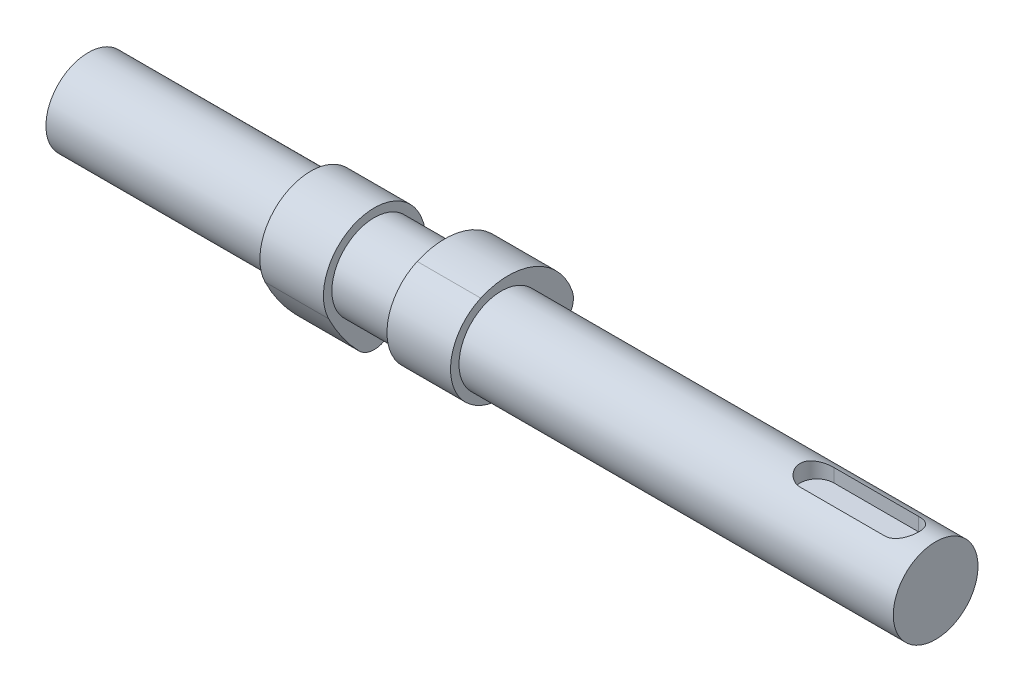
ISO-10303-21;
HEADER;
FILE_DESCRIPTION(('STEP AP214'),'2;1');
FILE_NAME('part.step','',(''),(''),'','','');
FILE_SCHEMA(('AUTOMOTIVE_DESIGN { 1 0 10303 214 1 1 1 1 }'));
ENDSEC;
DATA;
#1=APPLICATION_CONTEXT('core data for automotive mechanical design processes');
#2=APPLICATION_PROTOCOL_DEFINITION('international standard','automotive_design',2000,#1);
#3=PRODUCT_CONTEXT('',#1,'mechanical');
#4=PRODUCT('Part','Part','',(#3));
#5=PRODUCT_RELATED_PRODUCT_CATEGORY('part','',(#4));
#6=PRODUCT_DEFINITION_FORMATION('','',#4);
#7=PRODUCT_DEFINITION_CONTEXT('part definition',#1,'design');
#8=PRODUCT_DEFINITION('design','',#6,#7);
#9=PRODUCT_DEFINITION_SHAPE('','',#8);
#10=(LENGTH_UNIT() NAMED_UNIT(*) SI_UNIT(.MILLI.,.METRE.));
#11=(NAMED_UNIT(*) PLANE_ANGLE_UNIT() SI_UNIT($,.RADIAN.));
#12=(NAMED_UNIT(*) SI_UNIT($,.STERADIAN.) SOLID_ANGLE_UNIT());
#13=UNCERTAINTY_MEASURE_WITH_UNIT(LENGTH_MEASURE(1.E-05),#10,'distance_accuracy_value','');
#14=(GEOMETRIC_REPRESENTATION_CONTEXT(3) GLOBAL_UNCERTAINTY_ASSIGNED_CONTEXT((#13)) GLOBAL_UNIT_ASSIGNED_CONTEXT((#10,
#11,#12)) REPRESENTATION_CONTEXT('',''));
#15=CARTESIAN_POINT('',(0.,0.,0.));
#16=DIRECTION('',(0.,0.,1.));
#17=DIRECTION('',(1.,0.,0.));
#18=AXIS2_PLACEMENT_3D('',#15,#16,#17);
#19=CARTESIAN_POINT('',(125.,0.,0.));
#20=DIRECTION('',(-1.,0.,0.));
#21=DIRECTION('',(0.,0.,1.));
#22=AXIS2_PLACEMENT_3D('',#19,#20,#21);
#23=CYLINDRICAL_SURFACE('',#22,10.);
#24=CARTESIAN_POINT('',(7.50000000000001,0.,0.));
#25=DIRECTION('',(-1.,0.,0.));
#26=DIRECTION('',(0.,0.,1.));
#27=AXIS2_PLACEMENT_3D('',#24,#25,#26);
#28=CIRCLE('',#27,10.);
#29=CARTESIAN_POINT('',(7.50000000000001,0.,10.));
#30=VERTEX_POINT('',#29);
#31=EDGE_CURVE('E164',#30,#30,#28,.T.);
#32=ORIENTED_EDGE('',*,*,#31,.T.);
#33=EDGE_LOOP('',(#32));
#34=FACE_BOUND('',#33,.T.);
#35=CARTESIAN_POINT('',(-7.50000000000001,0.,0.));
#36=DIRECTION('',(1.,0.,0.));
#37=DIRECTION('',(0.,0.,-1.));
#38=AXIS2_PLACEMENT_3D('',#35,#36,#37);
#39=CIRCLE('',#38,10.);
#40=CARTESIAN_POINT('',(-7.50000000000001,0.,-10.));
#41=VERTEX_POINT('',#40);
#42=EDGE_CURVE('E220',#41,#41,#39,.T.);
#43=ORIENTED_EDGE('',*,*,#42,.T.);
#44=EDGE_LOOP('',(#43));
#45=FACE_BOUND('',#44,.T.);
#46=ADVANCED_FACE('F45',(#34,#45),#23,.T.);
#47=CARTESIAN_POINT('',(-22.5,-1.62236318948023,3.65621904177246));
#48=DIRECTION('',(1.,0.,0.));
#49=DIRECTION('',(0.,1.,0.));
#50=AXIS2_PLACEMENT_3D('',#47,#48,#49);
#51=CYLINDRICAL_SURFACE('',#50,16.);
#52=CARTESIAN_POINT('',(-7.5,-1.62236318948023,3.65621904177246));
#53=DIRECTION('',(1.,0.,0.));
#54=DIRECTION('',(0.,1.,0.));
#55=AXIS2_PLACEMENT_3D('',#52,#53,#54);
#56=CIRCLE('',#55,16.);
#57=CARTESIAN_POINT('',(-7.5,-16.7126720366766,-1.66191774626015));
#58=VERTEX_POINT('',#57);
#59=CARTESIAN_POINT('',(-7.5,4.86708956844069,-10.9686571253174));
#60=VERTEX_POINT('',#59);
#61=EDGE_CURVE('E170',#58,#60,#56,.T.);
#62=ORIENTED_EDGE('',*,*,#61,.F.);
#63=DIRECTION('',(1.,0.,0.));
#64=VECTOR('',#63,1.);
#65=CARTESIAN_POINT('',(-22.5,-16.7126720366766,-1.66191774626015));
#66=LINE('',#65,#64);
#67=CARTESIAN_POINT('',(-22.5,-16.7126720366766,-1.66191774626015));
#68=VERTEX_POINT('',#67);
#69=EDGE_CURVE('E191',#68,#58,#66,.T.);
#70=ORIENTED_EDGE('',*,*,#69,.F.);
#71=CARTESIAN_POINT('',(-22.5,-1.62236318948023,3.65621904177246));
#72=DIRECTION('',(1.,0.,0.));
#73=DIRECTION('',(0.,1.,0.));
#74=AXIS2_PLACEMENT_3D('',#71,#72,#73);
#75=CIRCLE('',#74,16.);
#76=CARTESIAN_POINT('',(-22.5,4.86708956844069,-10.9686571253174));
#77=VERTEX_POINT('',#76);
#78=EDGE_CURVE('E175',#68,#77,#75,.T.);
#79=ORIENTED_EDGE('',*,*,#78,.T.);
#80=DIRECTION('',(1.,0.,0.));
#81=VECTOR('',#80,1.);
#82=CARTESIAN_POINT('',(-22.5,4.86708956844069,-10.9686571253174));
#83=LINE('',#82,#81);
#84=EDGE_CURVE('E216',#77,#60,#83,.T.);
#85=ORIENTED_EDGE('',*,*,#84,.T.);
#86=EDGE_LOOP('',(#62,#70,#79,#85));
#87=FACE_BOUND('',#86,.T.);
#88=ADVANCED_FACE('F303',(#87),#51,.T.);
#89=CARTESIAN_POINT('',(-22.5,0.,0.));
#90=DIRECTION('',(1.,0.,0.));
#91=DIRECTION('',(0.,1.,0.));
#92=AXIS2_PLACEMENT_3D('',#89,#90,#91);
#93=CYLINDRICAL_SURFACE('',#92,12.);
#94=CARTESIAN_POINT('',(-7.5,0.,0.));
#95=DIRECTION('',(1.,0.,0.));
#96=DIRECTION('',(0.,-1.,0.));
#97=AXIS2_PLACEMENT_3D('',#94,#95,#96);
#98=CIRCLE('',#97,12.);
#99=CARTESIAN_POINT('',(-7.5,-5.30622661682884,10.7630831591537));
#100=VERTEX_POINT('',#99);
#101=EDGE_CURVE('E195',#60,#100,#98,.T.);
#102=ORIENTED_EDGE('',*,*,#101,.F.);
#103=ORIENTED_EDGE('',*,*,#84,.F.);
#104=CARTESIAN_POINT('',(-22.5,0.,0.));
#105=DIRECTION('',(1.,0.,0.));
#106=DIRECTION('',(0.,-1.,0.));
#107=AXIS2_PLACEMENT_3D('',#104,#105,#106);
#108=CIRCLE('',#107,12.);
#109=CARTESIAN_POINT('',(-22.5,-5.30622661682884,10.7630831591537));
#110=VERTEX_POINT('',#109);
#111=EDGE_CURVE('E179',#77,#110,#108,.T.);
#112=ORIENTED_EDGE('',*,*,#111,.T.);
#113=DIRECTION('',(1.,0.,0.));
#114=VECTOR('',#113,1.);
#115=CARTESIAN_POINT('',(-22.5,-5.30622661682884,10.7630831591537));
#116=LINE('',#115,#114);
#117=EDGE_CURVE('E212',#110,#100,#116,.T.);
#118=ORIENTED_EDGE('',*,*,#117,.T.);
#119=EDGE_LOOP('',(#102,#103,#112,#118));
#120=FACE_BOUND('',#119,.T.);
#121=ADVANCED_FACE('F309',(#120),#93,.T.);
#122=CARTESIAN_POINT('',(-22.5,12.3811954392673,-25.1138607046919));
#123=DIRECTION('',(1.,0.,0.));
#124=DIRECTION('',(0.,1.,0.));
#125=AXIS2_PLACEMENT_3D('',#122,#123,#124);
#126=CYLINDRICAL_SURFACE('',#125,40.);
#127=CARTESIAN_POINT('',(-7.5,12.3811954392673,-25.1138607046919));
#128=DIRECTION('',(1.,0.,0.));
#129=DIRECTION('',(0.,-1.,0.));
#130=AXIS2_PLACEMENT_3D('',#127,#128,#129);
#131=CIRCLE('',#130,40.);
#132=CARTESIAN_POINT('',(-7.5,-15.4795428020985,3.5876943863846));
#133=VERTEX_POINT('',#132);
#134=EDGE_CURVE('E199',#100,#133,#131,.T.);
#135=ORIENTED_EDGE('',*,*,#134,.F.);
#136=ORIENTED_EDGE('',*,*,#117,.F.);
#137=CARTESIAN_POINT('',(-22.5,12.3811954392673,-25.1138607046919));
#138=DIRECTION('',(1.,0.,0.));
#139=DIRECTION('',(0.,-1.,0.));
#140=AXIS2_PLACEMENT_3D('',#137,#138,#139);
#141=CIRCLE('',#140,40.);
#142=CARTESIAN_POINT('',(-22.5,-15.4795428020985,3.5876943863846));
#143=VERTEX_POINT('',#142);
#144=EDGE_CURVE('E184',#110,#143,#141,.T.);
#145=ORIENTED_EDGE('',*,*,#144,.T.);
#146=DIRECTION('',(1.,0.,0.));
#147=VECTOR('',#146,1.);
#148=CARTESIAN_POINT('',(-22.5,-15.4795428020985,3.5876943863846));
#149=LINE('',#148,#147);
#150=EDGE_CURVE('E208',#143,#133,#149,.T.);
#151=ORIENTED_EDGE('',*,*,#150,.T.);
#152=EDGE_LOOP('',(#135,#136,#145,#151));
#153=FACE_BOUND('',#152,.T.);
#154=ADVANCED_FACE('F429',(#153),#126,.T.);
#155=CARTESIAN_POINT('',(-22.5,-11.9969505219278,0.));
#156=DIRECTION('',(1.,0.,0.));
#157=DIRECTION('',(0.,1.,0.));
#158=AXIS2_PLACEMENT_3D('',#155,#156,#157);
#159=CYLINDRICAL_SURFACE('',#158,5.);
#160=CARTESIAN_POINT('',(-7.5,-11.9969505219278,0.));
#161=DIRECTION('',(1.,0.,0.));
#162=DIRECTION('',(0.,-1.,0.));
#163=AXIS2_PLACEMENT_3D('',#160,#161,#162);
#164=CIRCLE('',#163,5.);
#165=EDGE_CURVE('E180',#133,#58,#164,.T.);
#166=ORIENTED_EDGE('',*,*,#165,.F.);
#167=ORIENTED_EDGE('',*,*,#150,.F.);
#168=CARTESIAN_POINT('',(-22.5,-11.9969505219278,0.));
#169=DIRECTION('',(1.,0.,0.));
#170=DIRECTION('',(0.,-1.,0.));
#171=AXIS2_PLACEMENT_3D('',#168,#169,#170);
#172=CIRCLE('',#171,5.);
#173=EDGE_CURVE('E188',#143,#68,#172,.T.);
#174=ORIENTED_EDGE('',*,*,#173,.T.);
#175=ORIENTED_EDGE('',*,*,#69,.T.);
#176=EDGE_LOOP('',(#166,#167,#174,#175));
#177=FACE_BOUND('',#176,.T.);
#178=ADVANCED_FACE('F421',(#177),#159,.T.);
#179=CARTESIAN_POINT('',(-22.5,-6.80965685570399,1.82810952088625));
#180=DIRECTION('',(1.,0.,0.));
#181=DIRECTION('',(0.,1.,0.));
#182=AXIS2_PLACEMENT_3D('',#179,#180,#181);
#183=PLANE('',#182);
#184=CARTESIAN_POINT('',(-22.5,0.,0.));
#185=DIRECTION('',(1.,0.,0.));
#186=DIRECTION('',(0.,0.,-1.));
#187=AXIS2_PLACEMENT_3D('',#184,#185,#186);
#188=CIRCLE('',#187,10.);
#189=CARTESIAN_POINT('',(-22.5,0.,-10.));
#190=VERTEX_POINT('',#189);
#191=EDGE_CURVE('E54',#190,#190,#188,.T.);
#192=ORIENTED_EDGE('',*,*,#191,.T.);
#193=EDGE_LOOP('',(#192));
#194=FACE_BOUND('',#193,.T.);
#195=ORIENTED_EDGE('',*,*,#78,.F.);
#196=ORIENTED_EDGE('',*,*,#173,.F.);
#197=ORIENTED_EDGE('',*,*,#144,.F.);
#198=ORIENTED_EDGE('',*,*,#111,.F.);
#199=EDGE_LOOP('',(#195,#196,#197,#198));
#200=FACE_BOUND('',#199,.T.);
#201=ADVANCED_FACE('F412',(#194,#200),#183,.F.);
#202=CARTESIAN_POINT('',(-7.5,-6.80965685570399,1.82810952088625));
#203=DIRECTION('',(1.,0.,0.));
#204=DIRECTION('',(0.,1.,0.));
#205=AXIS2_PLACEMENT_3D('',#202,#203,#204);
#206=PLANE('',#205);
#207=ORIENTED_EDGE('',*,*,#42,.F.);
#208=EDGE_LOOP('',(#207));
#209=FACE_BOUND('',#208,.T.);
#210=ORIENTED_EDGE('',*,*,#61,.T.);
#211=ORIENTED_EDGE('',*,*,#101,.T.);
#212=ORIENTED_EDGE('',*,*,#134,.T.);
#213=ORIENTED_EDGE('',*,*,#165,.T.);
#214=EDGE_LOOP('',(#210,#211,#212,#213));
#215=FACE_BOUND('',#214,.T.);
#216=ADVANCED_FACE('F292',(#209,#215),#206,.T.);
#217=CARTESIAN_POINT('',(-75.,0.,0.));
#218=DIRECTION('',(1.,0.,0.));
#219=DIRECTION('',(0.,0.,-1.));
#220=AXIS2_PLACEMENT_3D('',#217,#218,#219);
#221=PLANE('',#220);
#222=CARTESIAN_POINT('',(-75.,0.,0.));
#223=DIRECTION('',(1.,0.,0.));
#224=DIRECTION('',(0.,0.,-1.));
#225=AXIS2_PLACEMENT_3D('',#222,#223,#224);
#226=CIRCLE('',#225,10.);
#227=CARTESIAN_POINT('',(-75.,0.,-10.));
#228=VERTEX_POINT('',#227);
#229=EDGE_CURVE('E241',#228,#228,#226,.T.);
#230=ORIENTED_EDGE('',*,*,#229,.F.);
#231=EDGE_LOOP('',(#230));
#232=FACE_BOUND('',#231,.T.);
#233=ADVANCED_FACE('F289',(#232),#221,.F.);
#234=ORIENTED_EDGE('',*,*,#229,.T.);
#235=EDGE_LOOP('',(#234));
#236=FACE_BOUND('',#235,.T.);
#237=ORIENTED_EDGE('',*,*,#191,.F.);
#238=EDGE_LOOP('',(#237));
#239=FACE_BOUND('',#238,.T.);
#240=ADVANCED_FACE('F291',(#236,#239),#23,.T.);
#241=CARTESIAN_POINT('',(22.5,-3.65621904177246,-1.62236318948024));
#242=DIRECTION('',(-1.,0.,0.));
#243=DIRECTION('',(0.,0.,1.));
#244=AXIS2_PLACEMENT_3D('',#241,#242,#243);
#245=CYLINDRICAL_SURFACE('',#244,16.);
#246=CARTESIAN_POINT('',(7.5,-3.65621904177246,-1.62236318948024));
#247=DIRECTION('',(1.,0.,0.));
#248=DIRECTION('',(0.,0.,1.));
#249=AXIS2_PLACEMENT_3D('',#246,#247,#248);
#250=CIRCLE('',#249,16.);
#251=CARTESIAN_POINT('',(7.5,1.6619177462602,-16.7126720366766));
#252=VERTEX_POINT('',#251);
#253=CARTESIAN_POINT('',(7.5,10.9686571253174,4.86708956844073));
#254=VERTEX_POINT('',#253);
#255=EDGE_CURVE('E162',#252,#254,#250,.T.);
#256=ORIENTED_EDGE('',*,*,#255,.T.);
#257=DIRECTION('',(-1.,0.,0.));
#258=VECTOR('',#257,1.);
#259=CARTESIAN_POINT('',(22.5,10.9686571253174,4.86708956844073));
#260=LINE('',#259,#258);
#261=CARTESIAN_POINT('',(22.5,10.9686571253174,4.86708956844073));
#262=VERTEX_POINT('',#261);
#263=EDGE_CURVE('E140',#262,#254,#260,.T.);
#264=ORIENTED_EDGE('',*,*,#263,.F.);
#265=CARTESIAN_POINT('',(22.5,-3.65621904177246,-1.62236318948024));
#266=DIRECTION('',(1.,0.,0.));
#267=DIRECTION('',(0.,0.,1.));
#268=AXIS2_PLACEMENT_3D('',#265,#266,#267);
#269=CIRCLE('',#268,16.);
#270=CARTESIAN_POINT('',(22.5,1.6619177462602,-16.7126720366766));
#271=VERTEX_POINT('',#270);
#272=EDGE_CURVE('E148',#271,#262,#269,.T.);
#273=ORIENTED_EDGE('',*,*,#272,.F.);
#274=DIRECTION('',(-1.,0.,0.));
#275=VECTOR('',#274,1.);
#276=CARTESIAN_POINT('',(22.5,1.6619177462602,-16.7126720366766));
#277=LINE('',#276,#275);
#278=EDGE_CURVE('E583',#271,#252,#277,.T.);
#279=ORIENTED_EDGE('',*,*,#278,.T.);
#280=EDGE_LOOP('',(#256,#264,#273,#279));
#281=FACE_BOUND('',#280,.T.);
#282=ADVANCED_FACE('F160',(#281),#245,.T.);
#283=CARTESIAN_POINT('',(22.5,0.,0.));
#284=DIRECTION('',(-1.,0.,0.));
#285=DIRECTION('',(0.,0.,1.));
#286=AXIS2_PLACEMENT_3D('',#283,#284,#285);
#287=CYLINDRICAL_SURFACE('',#286,12.);
#288=CARTESIAN_POINT('',(7.5,0.,0.));
#289=DIRECTION('',(1.,0.,0.));
#290=DIRECTION('',(0.,0.,-1.));
#291=AXIS2_PLACEMENT_3D('',#288,#289,#290);
#292=CIRCLE('',#291,12.);
#293=CARTESIAN_POINT('',(7.5,-10.7630831591536,-5.30622661682888));
#294=VERTEX_POINT('',#293);
#295=EDGE_CURVE('E580',#254,#294,#292,.T.);
#296=ORIENTED_EDGE('',*,*,#295,.T.);
#297=DIRECTION('',(-1.,0.,0.));
#298=VECTOR('',#297,1.);
#299=CARTESIAN_POINT('',(22.5,-10.7630831591536,-5.30622661682888));
#300=LINE('',#299,#298);
#301=CARTESIAN_POINT('',(22.5,-10.7630831591536,-5.30622661682888));
#302=VERTEX_POINT('',#301);
#303=EDGE_CURVE('E143',#302,#294,#300,.T.);
#304=ORIENTED_EDGE('',*,*,#303,.F.);
#305=CARTESIAN_POINT('',(22.5,0.,0.));
#306=DIRECTION('',(1.,0.,0.));
#307=DIRECTION('',(0.,0.,-1.));
#308=AXIS2_PLACEMENT_3D('',#305,#306,#307);
#309=CIRCLE('',#308,12.);
#310=EDGE_CURVE('E136',#262,#302,#309,.T.);
#311=ORIENTED_EDGE('',*,*,#310,.F.);
#312=ORIENTED_EDGE('',*,*,#263,.T.);
#313=EDGE_LOOP('',(#296,#304,#311,#312));
#314=FACE_BOUND('',#313,.T.);
#315=ADVANCED_FACE('F138',(#314),#287,.T.);
#316=CARTESIAN_POINT('',(22.5,25.1138607046918,12.3811954392674));
#317=DIRECTION('',(-1.,0.,0.));
#318=DIRECTION('',(0.,0.,1.));
#319=AXIS2_PLACEMENT_3D('',#316,#317,#318);
#320=CYLINDRICAL_SURFACE('',#319,40.);
#321=CARTESIAN_POINT('',(7.5,25.1138607046918,12.3811954392674));
#322=DIRECTION('',(1.,0.,0.));
#323=DIRECTION('',(0.,0.,-1.));
#324=AXIS2_PLACEMENT_3D('',#321,#322,#323);
#325=CIRCLE('',#324,40.);
#326=CARTESIAN_POINT('',(7.5,-3.58769438638454,-15.4795428020985));
#327=VERTEX_POINT('',#326);
#328=EDGE_CURVE('E575',#294,#327,#325,.T.);
#329=ORIENTED_EDGE('',*,*,#328,.T.);
#330=DIRECTION('',(-1.,0.,0.));
#331=VECTOR('',#330,1.);
#332=CARTESIAN_POINT('',(22.5,-3.58769438638454,-15.4795428020985));
#333=LINE('',#332,#331);
#334=CARTESIAN_POINT('',(22.5,-3.58769438638454,-15.4795428020985));
#335=VERTEX_POINT('',#334);
#336=EDGE_CURVE('E171',#335,#327,#333,.T.);
#337=ORIENTED_EDGE('',*,*,#336,.F.);
#338=CARTESIAN_POINT('',(22.5,25.1138607046918,12.3811954392674));
#339=DIRECTION('',(1.,0.,0.));
#340=DIRECTION('',(0.,0.,-1.));
#341=AXIS2_PLACEMENT_3D('',#338,#339,#340);
#342=CIRCLE('',#341,40.);
#343=EDGE_CURVE('E147',#302,#335,#342,.T.);
#344=ORIENTED_EDGE('',*,*,#343,.F.);
#345=ORIENTED_EDGE('',*,*,#303,.T.);
#346=EDGE_LOOP('',(#329,#337,#344,#345));
#347=FACE_BOUND('',#346,.T.);
#348=ADVANCED_FACE('F380',(#347),#320,.T.);
#349=CARTESIAN_POINT('',(22.5,0.,-11.9969505219278));
#350=DIRECTION('',(-1.,0.,0.));
#351=DIRECTION('',(0.,0.,1.));
#352=AXIS2_PLACEMENT_3D('',#349,#350,#351);
#353=CYLINDRICAL_SURFACE('',#352,5.);
#354=CARTESIAN_POINT('',(7.5,0.,-11.9969505219278));
#355=DIRECTION('',(1.,0.,0.));
#356=DIRECTION('',(0.,0.,-1.));
#357=AXIS2_PLACEMENT_3D('',#354,#355,#356);
#358=CIRCLE('',#357,5.);
#359=EDGE_CURVE('E158',#327,#252,#358,.T.);
#360=ORIENTED_EDGE('',*,*,#359,.T.);
#361=ORIENTED_EDGE('',*,*,#278,.F.);
#362=CARTESIAN_POINT('',(22.5,0.,-11.9969505219278));
#363=DIRECTION('',(1.,0.,0.));
#364=DIRECTION('',(0.,0.,-1.));
#365=AXIS2_PLACEMENT_3D('',#362,#363,#364);
#366=CIRCLE('',#365,5.);
#367=EDGE_CURVE('E153',#335,#271,#366,.T.);
#368=ORIENTED_EDGE('',*,*,#367,.F.);
#369=ORIENTED_EDGE('',*,*,#336,.T.);
#370=EDGE_LOOP('',(#360,#361,#368,#369));
#371=FACE_BOUND('',#370,.T.);
#372=ADVANCED_FACE('F371',(#371),#353,.T.);
#373=CARTESIAN_POINT('',(22.5,-1.82810952088623,-6.809656855704));
#374=DIRECTION('',(-1.,0.,0.));
#375=DIRECTION('',(0.,0.,1.));
#376=AXIS2_PLACEMENT_3D('',#373,#374,#375);
#377=PLANE('',#376);
#378=CARTESIAN_POINT('',(22.5,0.,0.));
#379=DIRECTION('',(-1.,0.,0.));
#380=DIRECTION('',(0.,0.,1.));
#381=AXIS2_PLACEMENT_3D('',#378,#379,#380);
#382=CIRCLE('',#381,10.);
#383=CARTESIAN_POINT('',(22.5,0.,10.));
#384=VERTEX_POINT('',#383);
#385=EDGE_CURVE('E11',#384,#384,#382,.T.);
#386=ORIENTED_EDGE('',*,*,#385,.T.);
#387=EDGE_LOOP('',(#386));
#388=FACE_BOUND('',#387,.T.);
#389=ORIENTED_EDGE('',*,*,#272,.T.);
#390=ORIENTED_EDGE('',*,*,#310,.T.);
#391=ORIENTED_EDGE('',*,*,#343,.T.);
#392=ORIENTED_EDGE('',*,*,#367,.T.);
#393=EDGE_LOOP('',(#389,#390,#391,#392));
#394=FACE_BOUND('',#393,.T.);
#395=ADVANCED_FACE('F151',(#388,#394),#377,.F.);
#396=CARTESIAN_POINT('',(7.5,-1.82810952088623,-6.809656855704));
#397=DIRECTION('',(-1.,0.,0.));
#398=DIRECTION('',(0.,0.,1.));
#399=AXIS2_PLACEMENT_3D('',#396,#397,#398);
#400=PLANE('',#399);
#401=ORIENTED_EDGE('',*,*,#31,.F.);
#402=EDGE_LOOP('',(#401));
#403=FACE_BOUND('',#402,.T.);
#404=ORIENTED_EDGE('',*,*,#255,.F.);
#405=ORIENTED_EDGE('',*,*,#359,.F.);
#406=ORIENTED_EDGE('',*,*,#328,.F.);
#407=ORIENTED_EDGE('',*,*,#295,.F.);
#408=EDGE_LOOP('',(#404,#405,#406,#407));
#409=FACE_BOUND('',#408,.T.);
#410=ADVANCED_FACE('F300',(#403,#409),#400,.T.);
#411=CARTESIAN_POINT('',(97.,6.,0.));
#412=DIRECTION('',(0.,1.,0.));
#413=DIRECTION('',(0.,0.,1.));
#414=AXIS2_PLACEMENT_3D('',#411,#412,#413);
#415=PLANE('',#414);
#416=CARTESIAN_POINT('',(97.,6.,0.));
#417=DIRECTION('',(0.,1.,0.));
#418=DIRECTION('',(0.,0.,1.));
#419=AXIS2_PLACEMENT_3D('',#416,#417,#418);
#420=CIRCLE('',#419,4.);
#421=CARTESIAN_POINT('',(97.,6.,-4.));
#422=VERTEX_POINT('',#421);
#423=CARTESIAN_POINT('',(97.,6.,4.));
#424=VERTEX_POINT('',#423);
#425=EDGE_CURVE('E221',#422,#424,#420,.T.);
#426=ORIENTED_EDGE('',*,*,#425,.T.);
#427=DIRECTION('',(1.,0.,0.));
#428=VECTOR('',#427,1.);
#429=CARTESIAN_POINT('',(97.,6.,4.));
#430=LINE('',#429,#428);
#431=CARTESIAN_POINT('',(117.,6.,4.));
#432=VERTEX_POINT('',#431);
#433=EDGE_CURVE('E225',#424,#432,#430,.T.);
#434=ORIENTED_EDGE('',*,*,#433,.T.);
#435=CARTESIAN_POINT('',(117.,6.,0.));
#436=DIRECTION('',(0.,1.,0.));
#437=DIRECTION('',(0.,0.,1.));
#438=AXIS2_PLACEMENT_3D('',#435,#436,#437);
#439=CIRCLE('',#438,4.);
#440=CARTESIAN_POINT('',(117.,6.,-4.));
#441=VERTEX_POINT('',#440);
#442=EDGE_CURVE('E229',#432,#441,#439,.T.);
#443=ORIENTED_EDGE('',*,*,#442,.T.);
#444=DIRECTION('',(-1.,0.,0.));
#445=VECTOR('',#444,1.);
#446=CARTESIAN_POINT('',(97.,6.,-4.));
#447=LINE('',#446,#445);
#448=EDGE_CURVE('E233',#441,#422,#447,.T.);
#449=ORIENTED_EDGE('',*,*,#448,.T.);
#450=EDGE_LOOP('',(#426,#434,#443,#449));
#451=FACE_BOUND('',#450,.T.);
#452=ADVANCED_FACE('F295',(#451),#415,.T.);
#453=CARTESIAN_POINT('',(125.,0.,0.));
#454=DIRECTION('',(1.,0.,0.));
#455=DIRECTION('',(0.,0.,-1.));
#456=AXIS2_PLACEMENT_3D('',#453,#454,#455);
#457=PLANE('',#456);
#458=CARTESIAN_POINT('',(125.,0.,0.));
#459=DIRECTION('',(1.,0.,0.));
#460=DIRECTION('',(0.,0.,-1.));
#461=AXIS2_PLACEMENT_3D('',#458,#459,#460);
#462=CIRCLE('',#461,10.);
#463=CARTESIAN_POINT('',(125.,0.,-10.));
#464=VERTEX_POINT('',#463);
#465=EDGE_CURVE('E254',#464,#464,#462,.T.);
#466=ORIENTED_EDGE('',*,*,#465,.T.);
#467=EDGE_LOOP('',(#466));
#468=FACE_BOUND('',#467,.T.);
#469=ADVANCED_FACE('F288',(#468),#457,.T.);
#470=CARTESIAN_POINT('',(97.,6.,0.));
#471=DIRECTION('',(0.,1.,0.));
#472=DIRECTION('',(0.,0.,1.));
#473=AXIS2_PLACEMENT_3D('',#470,#471,#472);
#474=CYLINDRICAL_SURFACE('',#473,4.);
#475=DIRECTION('',(0.,1.,0.));
#476=VECTOR('',#475,1.);
#477=CARTESIAN_POINT('',(97.,6.,4.));
#478=LINE('',#477,#476);
#479=CARTESIAN_POINT('',(97.,9.16515138991168,4.));
#480=VERTEX_POINT('',#479);
#481=EDGE_CURVE('E237',#424,#480,#478,.T.);
#482=ORIENTED_EDGE('',*,*,#481,.F.);
#483=ORIENTED_EDGE('',*,*,#425,.F.);
#484=DIRECTION('',(0.,1.,0.));
#485=VECTOR('',#484,1.);
#486=CARTESIAN_POINT('',(97.,6.,-4.));
#487=LINE('',#486,#485);
#488=CARTESIAN_POINT('',(97.,9.16515138991168,-4.));
#489=VERTEX_POINT('',#488);
#490=EDGE_CURVE('E238',#422,#489,#487,.T.);
#491=ORIENTED_EDGE('',*,*,#490,.T.);
#492=CARTESIAN_POINT('',(97.,9.16515138991168,4.));
#493=CARTESIAN_POINT('',(96.8923882949458,9.16512928809544,4.00001596071938));
#494=CARTESIAN_POINT('',(96.7847886688333,9.16704612011428,3.99565782731266));
#495=CARTESIAN_POINT('',(96.5704574034612,9.17459250745478,3.9783181194646));
#496=CARTESIAN_POINT('',(96.4637254492831,9.18022064873058,3.96533982937531));
#497=CARTESIAN_POINT('',(96.2523063568937,9.19499565865171,3.93095207352899));
#498=CARTESIAN_POINT('',(96.1476128319149,9.20412861441611,3.90957593640916));
#499=CARTESIAN_POINT('',(95.9405984565681,9.22560106586818,3.85863260381273));
#500=CARTESIAN_POINT('',(95.8382777514449,9.23794075728508,3.82906490834148));
#501=CARTESIAN_POINT('',(95.5361282988375,9.2791858250141,3.72853943587112));
#502=CARTESIAN_POINT('',(95.3406915386172,9.3123489831615,3.64568978920222));
#503=CARTESIAN_POINT('',(94.9664088398381,9.38624741529469,3.45096383184148));
#504=CARTESIAN_POINT('',(94.7875788940914,9.42698987727425,3.33905992673095));
#505=CARTESIAN_POINT('',(94.4414752066361,9.51401998804847,3.08263671474507));
#506=CARTESIAN_POINT('',(94.2752655660996,9.56048491272144,2.93673827988501));
#507=CARTESIAN_POINT('',(93.9689194556385,9.65225581096199,2.61939292349378));
#508=CARTESIAN_POINT('',(93.8287883384928,9.69756154495612,2.44794076987998));
#509=CARTESIAN_POINT('',(93.5731872113755,9.78406834216145,2.07601181629753));
#510=CARTESIAN_POINT('',(93.4589103805898,9.82503649102096,1.87465586655103));
#511=CARTESIAN_POINT('',(93.2663118555086,9.89607888234979,1.45364828604453));
#512=CARTESIAN_POINT('',(93.1879751552067,9.92615767032247,1.23400433637532));
#513=CARTESIAN_POINT('',(93.0733175942291,9.97076629361036,0.793934884187379));
#514=CARTESIAN_POINT('',(93.0351460866969,9.98597845290694,0.57406211486903));
#515=CARTESIAN_POINT('',(92.9959430515965,10.001606202074,0.130536855092212));
#516=CARTESIAN_POINT('',(92.9948983667482,10.0020270338048,-0.0931142682526723));
#517=CARTESIAN_POINT('',(93.0289656379282,9.98843920775428,-0.524466731987226));
#518=CARTESIAN_POINT('',(93.0620499465532,9.97523973659777,-0.732358330632746));
#519=CARTESIAN_POINT('',(93.1599870009102,9.93698538393897,-1.13934964738688));
#520=CARTESIAN_POINT('',(93.2248415445704,9.91192983148495,-1.33844886722558));
#521=CARTESIAN_POINT('',(93.3852720377719,9.85193670608706,-1.72579479688348));
#522=CARTESIAN_POINT('',(93.481296395839,9.81685584875391,-1.91383264586891));
#523=CARTESIAN_POINT('',(93.7009312637048,9.74029168639969,-2.2716159956307));
#524=CARTESIAN_POINT('',(93.8245514514378,9.69880613681324,-2.4413550479227));
#525=CARTESIAN_POINT('',(94.1052800574364,9.61043706268122,-2.7695225783069));
#526=CARTESIAN_POINT('',(94.2640530171164,9.56337795745419,-2.92647922614483));
#527=CARTESIAN_POINT('',(94.6059921366628,9.47123359153046,-3.2122147086262));
#528=CARTESIAN_POINT('',(94.7891693487996,9.42614923753061,-3.34098070594789));
#529=CARTESIAN_POINT('',(95.0816356456234,9.36326134539255,-3.51186134851388));
#530=CARTESIAN_POINT('',(95.1836718383149,9.34283170142195,-3.56571263251515));
#531=CARTESIAN_POINT('',(95.3923923024092,9.30450957703985,-3.66454761505659));
#532=CARTESIAN_POINT('',(95.4990745457273,9.28661600381593,-3.70953513634086));
#533=CARTESIAN_POINT('',(95.7162289304962,9.25400250539921,-3.79016254319007));
#534=CARTESIAN_POINT('',(95.8266961700413,9.23927864276951,-3.82581403809398));
#535=CARTESIAN_POINT('',(96.0506683681487,9.2135146773091,-3.88744848158463));
#536=CARTESIAN_POINT('',(96.1641719402125,9.20247292309662,-3.91343576505911));
#537=CARTESIAN_POINT('',(96.3974454473375,9.18417798205495,-3.95619393609845));
#538=CARTESIAN_POINT('',(96.5172941945638,9.17707470750587,-3.97260125584169));
#539=CARTESIAN_POINT('',(96.758090929137,9.16754485606458,-3.99451448409732));
#540=CARTESIAN_POINT('',(96.8790381929227,9.16511539745838,-4.0000271099601));
#541=CARTESIAN_POINT('',(97.,9.16515138991168,-4.));
#542=B_SPLINE_CURVE_WITH_KNOTS('',3,(#492,#493,#494,#495,#496,#497,#498,#499,#500,#501,#502,
#503,#504,#505,#506,#507,#508,#509,#510,#511,#512,#513,#514,#515,#516,#517,#518,#519,#520,#521,
#522,#523,#524,#525,#526,#527,#528,#529,#530,#531,#532,#533,#534,#535,#536,#537,#538,#539,#540,
#541),.UNSPECIFIED.,.F.,.F.,(4,2,2,2,2,2,2,2,2,2,2,2,2,2,2,2,2,2,2,2,2,2,2,2,4),(0.,
0.322709706217834,0.645296527806424,0.966615822543774,1.28795473422461,1.92936600351818,
2.5713886988925,3.24636095994996,3.92147161082383,4.62325717855527,5.32474946398644,
5.99227753012539,6.65956903033311,7.2893783052307,7.91922322615308,8.55856353859093,
9.19812842270037,9.87963749353246,10.5614562641081,10.9125878460839,11.2635676597187,
11.6141089352909,11.964492785171,12.3274303244848,12.6901440171997),.UNSPECIFIED.);
#543=EDGE_CURVE('E61',#480,#489,#542,.T.);
#544=ORIENTED_EDGE('',*,*,#543,.F.);
#545=EDGE_LOOP('',(#482,#483,#491,#544));
#546=FACE_BOUND('',#545,.T.);
#547=ADVANCED_FACE('F283',(#546),#474,.F.);
#548=CARTESIAN_POINT('',(97.,6.,4.));
#549=DIRECTION('',(0.,0.,1.));
#550=DIRECTION('',(1.,0.,0.));
#551=AXIS2_PLACEMENT_3D('',#548,#549,#550);
#552=PLANE('',#551);
#553=DIRECTION('',(0.,1.,0.));
#554=VECTOR('',#553,1.);
#555=CARTESIAN_POINT('',(117.,6.,4.));
#556=LINE('',#555,#554);
#557=CARTESIAN_POINT('',(117.,9.16515138991168,4.));
#558=VERTEX_POINT('',#557);
#559=EDGE_CURVE('E245',#432,#558,#556,.T.);
#560=ORIENTED_EDGE('',*,*,#559,.F.);
#561=ORIENTED_EDGE('',*,*,#433,.F.);
#562=ORIENTED_EDGE('',*,*,#481,.T.);
#563=DIRECTION('',(-1.,0.,0.));
#564=VECTOR('',#563,1.);
#565=CARTESIAN_POINT('',(125.,9.16515138991168,4.));
#566=LINE('',#565,#564);
#567=EDGE_CURVE('E330',#558,#480,#566,.T.);
#568=ORIENTED_EDGE('',*,*,#567,.F.);
#569=EDGE_LOOP('',(#560,#561,#562,#568));
#570=FACE_BOUND('',#569,.T.);
#571=ADVANCED_FACE('F279',(#570),#552,.F.);
#572=CARTESIAN_POINT('',(117.,6.,0.));
#573=DIRECTION('',(0.,1.,0.));
#574=DIRECTION('',(0.,0.,1.));
#575=AXIS2_PLACEMENT_3D('',#572,#573,#574);
#576=CYLINDRICAL_SURFACE('',#575,4.);
#577=DIRECTION('',(0.,1.,0.));
#578=VECTOR('',#577,1.);
#579=CARTESIAN_POINT('',(117.,6.,-4.));
#580=LINE('',#579,#578);
#581=CARTESIAN_POINT('',(117.,9.16515138991168,-4.));
#582=VERTEX_POINT('',#581);
#583=EDGE_CURVE('E242',#441,#582,#580,.T.);
#584=ORIENTED_EDGE('',*,*,#583,.F.);
#585=ORIENTED_EDGE('',*,*,#442,.F.);
#586=ORIENTED_EDGE('',*,*,#559,.T.);
#587=CARTESIAN_POINT('',(117.,9.16515138991168,-4.));
#588=CARTESIAN_POINT('',(117.107611705054,9.16512928809544,-4.00001596071938));
#589=CARTESIAN_POINT('',(117.215211331167,9.16704612011429,-3.99565782731266));
#590=CARTESIAN_POINT('',(117.429542596539,9.17459250745478,-3.9783181194646));
#591=CARTESIAN_POINT('',(117.536274550717,9.18022064873058,-3.96533982937531));
#592=CARTESIAN_POINT('',(117.747693643106,9.19499565865171,-3.93095207352899));
#593=CARTESIAN_POINT('',(117.852387168085,9.20412861441611,-3.90957593640916));
#594=CARTESIAN_POINT('',(118.059401543432,9.22560106586818,-3.85863260381273));
#595=CARTESIAN_POINT('',(118.161722248555,9.23794075728508,-3.82906490834148));
#596=CARTESIAN_POINT('',(118.463871701162,9.2791858250141,-3.72853943587112));
#597=CARTESIAN_POINT('',(118.659308461383,9.3123489831615,-3.64568978920222));
#598=CARTESIAN_POINT('',(119.033591160162,9.38624741529469,-3.45096383184147));
#599=CARTESIAN_POINT('',(119.212421105909,9.42698987727425,-3.33905992673094));
#600=CARTESIAN_POINT('',(119.558524793364,9.51401998804847,-3.08263671474506));
#601=CARTESIAN_POINT('',(119.7247344339,9.56048491272144,-2.93673827988501));
#602=CARTESIAN_POINT('',(120.031080544362,9.65225581096199,-2.61939292349378));
#603=CARTESIAN_POINT('',(120.171211661507,9.69756154495612,-2.44794076987999));
#604=CARTESIAN_POINT('',(120.426812788624,9.78406834216144,-2.07601181629754));
#605=CARTESIAN_POINT('',(120.54108961941,9.82503649102096,-1.87465586655103));
#606=CARTESIAN_POINT('',(120.733688144491,9.89607888234979,-1.45364828604453));
#607=CARTESIAN_POINT('',(120.812024844793,9.92615767032247,-1.23400433637532));
#608=CARTESIAN_POINT('',(120.926682405771,9.97076629361036,-0.793934884187378));
#609=CARTESIAN_POINT('',(120.964853913303,9.98597845290694,-0.574062114869028));
#610=CARTESIAN_POINT('',(121.004056948403,10.001606202074,-0.130536855092209));
#611=CARTESIAN_POINT('',(121.005101633252,10.0020270338048,0.093114268252675));
#612=CARTESIAN_POINT('',(120.971034362072,9.98843920775428,0.52446673198723));
#613=CARTESIAN_POINT('',(120.937950053447,9.97523973659777,0.732358330632751));
#614=CARTESIAN_POINT('',(120.84001299909,9.93698538393897,1.13934964738688));
#615=CARTESIAN_POINT('',(120.77515845543,9.91192983148495,1.33844886722558));
#616=CARTESIAN_POINT('',(120.614727962228,9.85193670608706,1.72579479688348));
#617=CARTESIAN_POINT('',(120.518703604161,9.81685584875391,1.91383264586891));
#618=CARTESIAN_POINT('',(120.299068736295,9.74029168639969,2.2716159956307));
#619=CARTESIAN_POINT('',(120.175448548562,9.69880613681324,2.4413550479227));
#620=CARTESIAN_POINT('',(119.894719942564,9.61043706268122,2.7695225783069));
#621=CARTESIAN_POINT('',(119.735946982884,9.56337795745419,2.92647922614482));
#622=CARTESIAN_POINT('',(119.394007863337,9.47123359153046,3.21221470862619));
#623=CARTESIAN_POINT('',(119.2108306512,9.42614923753061,3.34098070594789));
#624=CARTESIAN_POINT('',(118.918364354377,9.36326134539255,3.51186134851389));
#625=CARTESIAN_POINT('',(118.816328161685,9.34283170142194,3.56571263251515));
#626=CARTESIAN_POINT('',(118.607607697591,9.30450957703985,3.66454761505659));
#627=CARTESIAN_POINT('',(118.500925454273,9.28661600381593,3.70953513634087));
#628=CARTESIAN_POINT('',(118.283771069504,9.25400250539921,3.79016254319008));
#629=CARTESIAN_POINT('',(118.173303829959,9.2392786427695,3.82581403809399));
#630=CARTESIAN_POINT('',(117.949331631851,9.2135146773091,3.88744848158463));
#631=CARTESIAN_POINT('',(117.835828059787,9.20247292309662,3.91343576505912));
#632=CARTESIAN_POINT('',(117.602554552662,9.18417798205495,3.95619393609845));
#633=CARTESIAN_POINT('',(117.482705805436,9.17707470750587,3.9726012558417));
#634=CARTESIAN_POINT('',(117.241909070863,9.16754485606458,3.99451448409732));
#635=CARTESIAN_POINT('',(117.120961807077,9.16511539745838,4.0000271099601));
#636=CARTESIAN_POINT('',(117.,9.16515138991168,4.));
#637=B_SPLINE_CURVE_WITH_KNOTS('',3,(#587,#588,#589,#590,#591,#592,#593,#594,#595,#596,#597,
#598,#599,#600,#601,#602,#603,#604,#605,#606,#607,#608,#609,#610,#611,#612,#613,#614,#615,#616,
#617,#618,#619,#620,#621,#622,#623,#624,#625,#626,#627,#628,#629,#630,#631,#632,#633,#634,#635,
#636),.UNSPECIFIED.,.F.,.F.,(4,2,2,2,2,2,2,2,2,2,2,2,2,2,2,2,2,2,2,2,2,2,2,2,4),(0.,
0.322709706217834,0.645296527806424,0.96661582254376,1.28795473422461,1.92936600351818,
2.57138869889252,3.24636095994996,3.92147161082381,4.62325717855526,5.32474946398644,
5.99227753012539,6.65956903033311,7.2893783052307,7.91922322615308,8.55856353859093,
9.19812842270037,9.87963749353242,10.5614562641081,10.9125878460839,11.2635676597188,
11.614108935291,11.964492785171,12.3274303244848,12.6901440171997),.UNSPECIFIED.);
#638=EDGE_CURVE('E258',#582,#558,#637,.T.);
#639=ORIENTED_EDGE('',*,*,#638,.F.);
#640=EDGE_LOOP('',(#584,#585,#586,#639));
#641=FACE_BOUND('',#640,.T.);
#642=ADVANCED_FACE('F273',(#641),#576,.F.);
#643=CARTESIAN_POINT('',(97.,6.,-4.));
#644=DIRECTION('',(0.,0.,-1.));
#645=DIRECTION('',(-1.,0.,0.));
#646=AXIS2_PLACEMENT_3D('',#643,#644,#645);
#647=PLANE('',#646);
#648=ORIENTED_EDGE('',*,*,#490,.F.);
#649=ORIENTED_EDGE('',*,*,#448,.F.);
#650=ORIENTED_EDGE('',*,*,#583,.T.);
#651=DIRECTION('',(-1.,0.,0.));
#652=VECTOR('',#651,1.);
#653=CARTESIAN_POINT('',(125.,9.16515138991168,-4.));
#654=LINE('',#653,#652);
#655=EDGE_CURVE('E69',#489,#582,#654,.F.);
#656=ORIENTED_EDGE('',*,*,#655,.F.);
#657=EDGE_LOOP('',(#648,#649,#650,#656));
#658=FACE_BOUND('',#657,.T.);
#659=ADVANCED_FACE('F278',(#658),#647,.F.);
#660=ORIENTED_EDGE('',*,*,#655,.T.);
#661=ORIENTED_EDGE('',*,*,#638,.T.);
#662=ORIENTED_EDGE('',*,*,#567,.T.);
#663=ORIENTED_EDGE('',*,*,#543,.T.);
#664=EDGE_LOOP('',(#660,#661,#662,#663));
#665=FACE_BOUND('',#664,.T.);
#666=ORIENTED_EDGE('',*,*,#465,.F.);
#667=EDGE_LOOP('',(#666));
#668=FACE_BOUND('',#667,.T.);
#669=ORIENTED_EDGE('',*,*,#385,.F.);
#670=EDGE_LOOP('',(#669));
#671=FACE_BOUND('',#670,.T.);
#672=ADVANCED_FACE('F305',(#665,#668,#671),#23,.T.);
#673=CLOSED_SHELL('',(#46,#88,#121,#154,#178,#201,#216,#233,#240,#282,#315,#348,#372,#395,#410,
#452,#469,#547,#571,#642,#659,#672));
#674=MANIFOLD_SOLID_BREP('B2',#673);
#675=ADVANCED_BREP_SHAPE_REPRESENTATION('',(#18,#674),#14);
#676=SHAPE_DEFINITION_REPRESENTATION(#9,#675);
ENDSEC;
END-ISO-10303-21;
